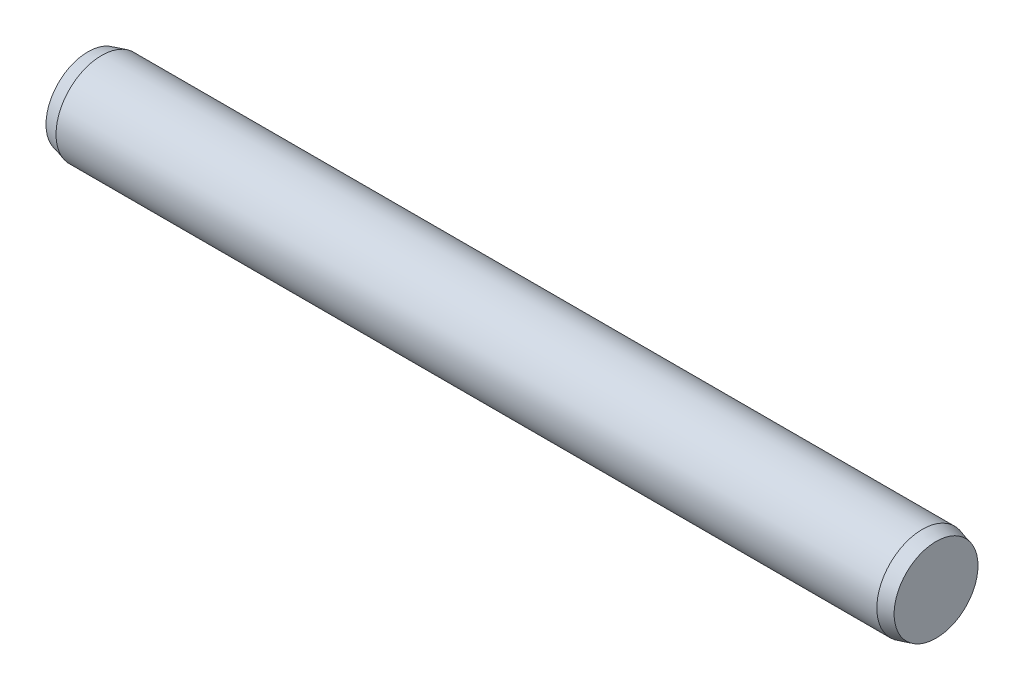
ISO-10303-21;
HEADER;
FILE_DESCRIPTION(('STEP AP214'),'2;1');
FILE_NAME('part.step','',(''),(''),'','','');
FILE_SCHEMA(('AUTOMOTIVE_DESIGN { 1 0 10303 214 1 1 1 1 }'));
ENDSEC;
DATA;
#1=APPLICATION_CONTEXT('core data for automotive mechanical design processes');
#2=APPLICATION_PROTOCOL_DEFINITION('international standard','automotive_design',2000,#1);
#3=PRODUCT_CONTEXT('',#1,'mechanical');
#4=PRODUCT('Part','Part','',(#3));
#5=PRODUCT_RELATED_PRODUCT_CATEGORY('part','',(#4));
#6=PRODUCT_DEFINITION_FORMATION('','',#4);
#7=PRODUCT_DEFINITION_CONTEXT('part definition',#1,'design');
#8=PRODUCT_DEFINITION('design','',#6,#7);
#9=PRODUCT_DEFINITION_SHAPE('','',#8);
#10=(LENGTH_UNIT() NAMED_UNIT(*) SI_UNIT(.MILLI.,.METRE.));
#11=(NAMED_UNIT(*) PLANE_ANGLE_UNIT() SI_UNIT($,.RADIAN.));
#12=(NAMED_UNIT(*) SI_UNIT($,.STERADIAN.) SOLID_ANGLE_UNIT());
#13=UNCERTAINTY_MEASURE_WITH_UNIT(LENGTH_MEASURE(1.E-05),#10,'distance_accuracy_value','');
#14=(GEOMETRIC_REPRESENTATION_CONTEXT(3) GLOBAL_UNCERTAINTY_ASSIGNED_CONTEXT((#13)) GLOBAL_UNIT_ASSIGNED_CONTEXT((#10,
#11,#12)) REPRESENTATION_CONTEXT('',''));
#15=CARTESIAN_POINT('',(0.,0.,0.));
#16=DIRECTION('',(0.,0.,1.));
#17=DIRECTION('',(1.,0.,0.));
#18=AXIS2_PLACEMENT_3D('',#15,#16,#17);
#19=CARTESIAN_POINT('',(-9.,0.,0.));
#20=DIRECTION('',(1.,0.,0.));
#21=DIRECTION('',(0.,0.,-1.));
#22=AXIS2_PLACEMENT_3D('',#19,#20,#21);
#23=CYLINDRICAL_SURFACE('',#22,1.);
#24=CARTESIAN_POINT('',(-9.,0.,0.));
#25=DIRECTION('',(-1.,0.,0.));
#26=DIRECTION('',(0.,0.,1.));
#27=AXIS2_PLACEMENT_3D('',#24,#25,#26);
#28=CIRCLE('',#27,1.);
#29=CARTESIAN_POINT('',(-9.,0.,1.));
#30=VERTEX_POINT('',#29);
#31=EDGE_CURVE('E44',#30,#30,#28,.T.);
#32=ORIENTED_EDGE('',*,*,#31,.F.);
#33=EDGE_LOOP('',(#32));
#34=FACE_BOUND('',#33,.T.);
#35=CARTESIAN_POINT('',(9.,0.,0.));
#36=DIRECTION('',(1.,0.,0.));
#37=DIRECTION('',(0.,0.,-1.));
#38=AXIS2_PLACEMENT_3D('',#35,#36,#37);
#39=CIRCLE('',#38,1.);
#40=CARTESIAN_POINT('',(9.,0.,-1.));
#41=VERTEX_POINT('',#40);
#42=EDGE_CURVE('E10',#41,#41,#39,.T.);
#43=ORIENTED_EDGE('',*,*,#42,.F.);
#44=EDGE_LOOP('',(#43));
#45=FACE_BOUND('',#44,.T.);
#46=ADVANCED_FACE('F30',(#34,#45),#23,.T.);
#47=CARTESIAN_POINT('',(9.,0.,0.));
#48=DIRECTION('',(-1.,0.,0.));
#49=DIRECTION('',(0.,0.,-1.));
#50=AXIS2_PLACEMENT_3D('',#47,#48,#49);
#51=CONICAL_SURFACE('',#50,1.,0.26179938779915);
#52=CARTESIAN_POINT('',(9.3,0.,0.));
#53=DIRECTION('',(1.,0.,0.));
#54=DIRECTION('',(0.,0.,-1.));
#55=AXIS2_PLACEMENT_3D('',#52,#53,#54);
#56=CIRCLE('',#55,0.919615242270665);
#57=CARTESIAN_POINT('',(9.3,0.,-0.919615242270665));
#58=VERTEX_POINT('',#57);
#59=EDGE_CURVE('E36',#58,#58,#56,.T.);
#60=ORIENTED_EDGE('',*,*,#59,.F.);
#61=EDGE_LOOP('',(#60));
#62=FACE_BOUND('',#61,.T.);
#63=ORIENTED_EDGE('',*,*,#42,.T.);
#64=EDGE_LOOP('',(#63));
#65=FACE_BOUND('',#64,.T.);
#66=ADVANCED_FACE('F54',(#62,#65),#51,.T.);
#67=CARTESIAN_POINT('',(9.3,0.,0.));
#68=DIRECTION('',(1.,0.,0.));
#69=DIRECTION('',(0.,0.,-1.));
#70=AXIS2_PLACEMENT_3D('',#67,#68,#69);
#71=PLANE('',#70);
#72=ORIENTED_EDGE('',*,*,#59,.T.);
#73=EDGE_LOOP('',(#72));
#74=FACE_BOUND('',#73,.T.);
#75=ADVANCED_FACE('F58',(#74),#71,.T.);
#76=CARTESIAN_POINT('',(-9.,0.,0.));
#77=DIRECTION('',(1.,0.,0.));
#78=DIRECTION('',(0.,0.,1.));
#79=AXIS2_PLACEMENT_3D('',#76,#77,#78);
#80=CONICAL_SURFACE('',#79,1.,0.26179938779915);
#81=CARTESIAN_POINT('',(-9.3,0.,0.));
#82=DIRECTION('',(-1.,0.,0.));
#83=DIRECTION('',(0.,0.,1.));
#84=AXIS2_PLACEMENT_3D('',#81,#82,#83);
#85=CIRCLE('',#84,0.919615242270665);
#86=CARTESIAN_POINT('',(-9.3,0.,0.919615242270665));
#87=VERTEX_POINT('',#86);
#88=EDGE_CURVE('E40',#87,#87,#85,.T.);
#89=ORIENTED_EDGE('',*,*,#88,.F.);
#90=EDGE_LOOP('',(#89));
#91=FACE_BOUND('',#90,.T.);
#92=ORIENTED_EDGE('',*,*,#31,.T.);
#93=EDGE_LOOP('',(#92));
#94=FACE_BOUND('',#93,.T.);
#95=ADVANCED_FACE('F50',(#91,#94),#80,.T.);
#96=CARTESIAN_POINT('',(-9.3,0.,0.));
#97=DIRECTION('',(-1.,0.,0.));
#98=DIRECTION('',(0.,0.,1.));
#99=AXIS2_PLACEMENT_3D('',#96,#97,#98);
#100=PLANE('',#99);
#101=ORIENTED_EDGE('',*,*,#88,.T.);
#102=EDGE_LOOP('',(#101));
#103=FACE_BOUND('',#102,.T.);
#104=ADVANCED_FACE('F67',(#103),#100,.T.);
#105=CLOSED_SHELL('',(#46,#66,#75,#95,#104));
#106=MANIFOLD_SOLID_BREP('B2',#105);
#107=ADVANCED_BREP_SHAPE_REPRESENTATION('',(#18,#106),#14);
#108=SHAPE_DEFINITION_REPRESENTATION(#9,#107);
ENDSEC;
END-ISO-10303-21;
